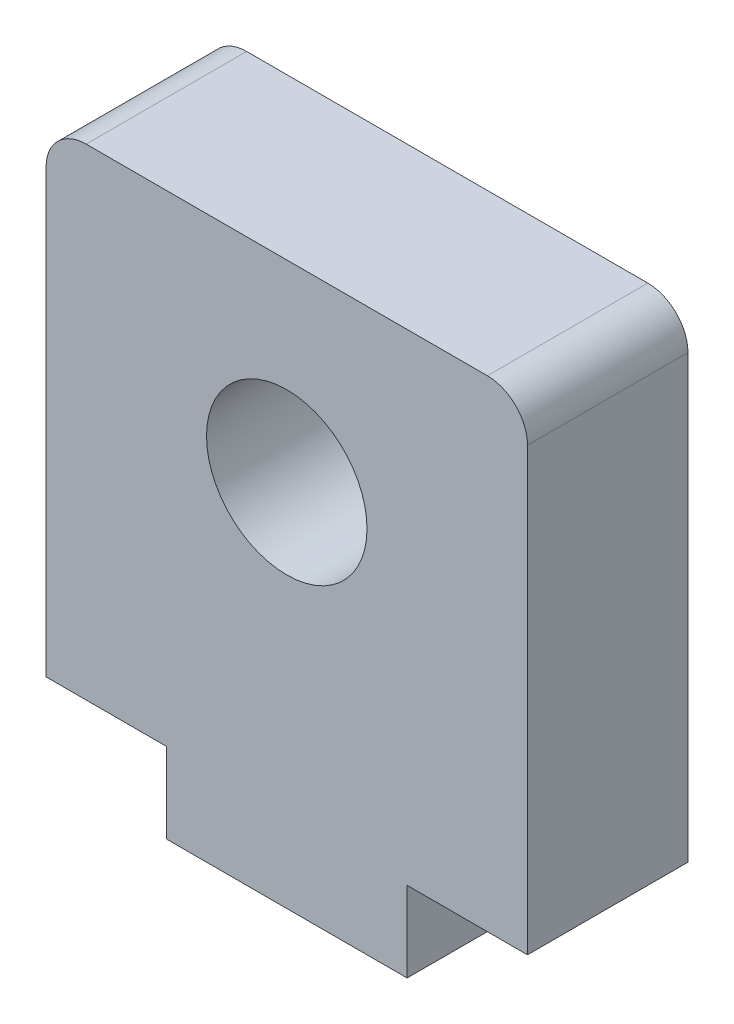
ISO-10303-21;
HEADER;
FILE_DESCRIPTION(('STEP AP214'),'2;1');
FILE_NAME('part.step','',(''),(''),'','','');
FILE_SCHEMA(('AUTOMOTIVE_DESIGN { 1 0 10303 214 1 1 1 1 }'));
ENDSEC;
DATA;
#1=APPLICATION_CONTEXT('core data for automotive mechanical design processes');
#2=APPLICATION_PROTOCOL_DEFINITION('international standard','automotive_design',2000,#1);
#3=PRODUCT_CONTEXT('',#1,'mechanical');
#4=PRODUCT('Part','Part','',(#3));
#5=PRODUCT_RELATED_PRODUCT_CATEGORY('part','',(#4));
#6=PRODUCT_DEFINITION_FORMATION('','',#4);
#7=PRODUCT_DEFINITION_CONTEXT('part definition',#1,'design');
#8=PRODUCT_DEFINITION('design','',#6,#7);
#9=PRODUCT_DEFINITION_SHAPE('','',#8);
#10=(LENGTH_UNIT() NAMED_UNIT(*) SI_UNIT(.MILLI.,.METRE.));
#11=(NAMED_UNIT(*) PLANE_ANGLE_UNIT() SI_UNIT($,.RADIAN.));
#12=(NAMED_UNIT(*) SI_UNIT($,.STERADIAN.) SOLID_ANGLE_UNIT());
#13=UNCERTAINTY_MEASURE_WITH_UNIT(LENGTH_MEASURE(1.E-05),#10,'distance_accuracy_value','');
#14=(GEOMETRIC_REPRESENTATION_CONTEXT(3) GLOBAL_UNCERTAINTY_ASSIGNED_CONTEXT((#13)) GLOBAL_UNIT_ASSIGNED_CONTEXT((#10,
#11,#12)) REPRESENTATION_CONTEXT('',''));
#15=CARTESIAN_POINT('',(0.,0.,0.));
#16=DIRECTION('',(0.,0.,1.));
#17=DIRECTION('',(1.,0.,0.));
#18=AXIS2_PLACEMENT_3D('',#15,#16,#17);
#19=CARTESIAN_POINT('',(-9.525,0.,6.35));
#20=DIRECTION('',(1.,0.,0.));
#21=DIRECTION('',(0.,1.,0.));
#22=AXIS2_PLACEMENT_3D('',#19,#20,#21);
#23=PLANE('',#22);
#24=DIRECTION('',(0.,-1.,0.));
#25=VECTOR('',#24,1.);
#26=CARTESIAN_POINT('',(-9.525,0.,6.35));
#27=LINE('',#26,#25);
#28=CARTESIAN_POINT('',(-9.525,9.52499999999999,6.35));
#29=VERTEX_POINT('',#28);
#30=CARTESIAN_POINT('',(-9.525,-7.93750000000001,6.35));
#31=VERTEX_POINT('',#30);
#32=EDGE_CURVE('E122',#29,#31,#27,.T.);
#33=ORIENTED_EDGE('',*,*,#32,.F.);
#34=DIRECTION('',(0.,0.,-1.));
#35=VECTOR('',#34,1.);
#36=CARTESIAN_POINT('',(-9.525,9.52499999999999,0.));
#37=LINE('',#36,#35);
#38=CARTESIAN_POINT('',(-9.525,9.52499999999999,0.));
#39=VERTEX_POINT('',#38);
#40=EDGE_CURVE('E12',#29,#39,#37,.T.);
#41=ORIENTED_EDGE('',*,*,#40,.T.);
#42=DIRECTION('',(0.,-1.,0.));
#43=VECTOR('',#42,1.);
#44=CARTESIAN_POINT('',(-9.525,0.,0.));
#45=LINE('',#44,#43);
#46=CARTESIAN_POINT('',(-9.525,-7.93750000000001,0.));
#47=VERTEX_POINT('',#46);
#48=EDGE_CURVE('E142',#39,#47,#45,.T.);
#49=ORIENTED_EDGE('',*,*,#48,.T.);
#50=DIRECTION('',(0.,0.,-1.));
#51=VECTOR('',#50,1.);
#52=CARTESIAN_POINT('',(-9.525,-7.93750000000001,6.35));
#53=LINE('',#52,#51);
#54=EDGE_CURVE('E135',#31,#47,#53,.T.);
#55=ORIENTED_EDGE('',*,*,#54,.F.);
#56=EDGE_LOOP('',(#33,#41,#49,#55));
#57=FACE_BOUND('',#56,.T.);
#58=ADVANCED_FACE('F46',(#57),#23,.F.);
#59=CARTESIAN_POINT('',(0.,-7.93750000000001,6.35));
#60=DIRECTION('',(0.,1.,0.));
#61=DIRECTION('',(0.,0.,1.));
#62=AXIS2_PLACEMENT_3D('',#59,#60,#61);
#63=PLANE('',#62);
#64=DIRECTION('',(1.,0.,0.));
#65=VECTOR('',#64,1.);
#66=CARTESIAN_POINT('',(0.,-7.93750000000001,0.));
#67=LINE('',#66,#65);
#68=CARTESIAN_POINT('',(-4.7625,-7.93750000000001,0.));
#69=VERTEX_POINT('',#68);
#70=EDGE_CURVE('E197',#47,#69,#67,.T.);
#71=ORIENTED_EDGE('',*,*,#70,.T.);
#72=DIRECTION('',(0.,0.,-1.));
#73=VECTOR('',#72,1.);
#74=CARTESIAN_POINT('',(-4.7625,-7.93750000000001,6.35));
#75=LINE('',#74,#73);
#76=CARTESIAN_POINT('',(-4.7625,-7.93750000000001,6.35));
#77=VERTEX_POINT('',#76);
#78=EDGE_CURVE('E137',#77,#69,#75,.T.);
#79=ORIENTED_EDGE('',*,*,#78,.F.);
#80=DIRECTION('',(1.,0.,0.));
#81=VECTOR('',#80,1.);
#82=CARTESIAN_POINT('',(0.,-7.93750000000001,6.35));
#83=LINE('',#82,#81);
#84=EDGE_CURVE('E125',#31,#77,#83,.T.);
#85=ORIENTED_EDGE('',*,*,#84,.F.);
#86=ORIENTED_EDGE('',*,*,#54,.T.);
#87=EDGE_LOOP('',(#71,#79,#85,#86));
#88=FACE_BOUND('',#87,.T.);
#89=ADVANCED_FACE('F134',(#88),#63,.F.);
#90=CARTESIAN_POINT('',(-4.7625,0.,6.35));
#91=DIRECTION('',(1.,0.,0.));
#92=DIRECTION('',(0.,0.,-1.));
#93=AXIS2_PLACEMENT_3D('',#90,#91,#92);
#94=PLANE('',#93);
#95=DIRECTION('',(0.,-1.,0.));
#96=VECTOR('',#95,1.);
#97=CARTESIAN_POINT('',(-4.7625,0.,0.));
#98=LINE('',#97,#96);
#99=CARTESIAN_POINT('',(-4.7625,-11.1125,0.));
#100=VERTEX_POINT('',#99);
#101=EDGE_CURVE('E199',#69,#100,#98,.T.);
#102=ORIENTED_EDGE('',*,*,#101,.T.);
#103=DIRECTION('',(0.,0.,-1.));
#104=VECTOR('',#103,1.);
#105=CARTESIAN_POINT('',(-4.7625,-11.1125,6.35));
#106=LINE('',#105,#104);
#107=CARTESIAN_POINT('',(-4.7625,-11.1125,6.35));
#108=VERTEX_POINT('',#107);
#109=EDGE_CURVE('E148',#108,#100,#106,.T.);
#110=ORIENTED_EDGE('',*,*,#109,.F.);
#111=DIRECTION('',(0.,-1.,0.));
#112=VECTOR('',#111,1.);
#113=CARTESIAN_POINT('',(-4.7625,0.,6.35));
#114=LINE('',#113,#112);
#115=EDGE_CURVE('E139',#77,#108,#114,.T.);
#116=ORIENTED_EDGE('',*,*,#115,.F.);
#117=ORIENTED_EDGE('',*,*,#78,.T.);
#118=EDGE_LOOP('',(#102,#110,#116,#117));
#119=FACE_BOUND('',#118,.T.);
#120=ADVANCED_FACE('F238',(#119),#94,.F.);
#121=CARTESIAN_POINT('',(0.,-11.1125,6.35));
#122=DIRECTION('',(0.,1.,0.));
#123=DIRECTION('',(0.,0.,1.));
#124=AXIS2_PLACEMENT_3D('',#121,#122,#123);
#125=PLANE('',#124);
#126=DIRECTION('',(1.,0.,0.));
#127=VECTOR('',#126,1.);
#128=CARTESIAN_POINT('',(0.,-11.1125,0.));
#129=LINE('',#128,#127);
#130=CARTESIAN_POINT('',(4.7625,-11.1125,0.));
#131=VERTEX_POINT('',#130);
#132=EDGE_CURVE('E202',#100,#131,#129,.T.);
#133=ORIENTED_EDGE('',*,*,#132,.T.);
#134=DIRECTION('',(0.,0.,-1.));
#135=VECTOR('',#134,1.);
#136=CARTESIAN_POINT('',(4.7625,-11.1125,6.35));
#137=LINE('',#136,#135);
#138=CARTESIAN_POINT('',(4.7625,-11.1125,6.35));
#139=VERTEX_POINT('',#138);
#140=EDGE_CURVE('E217',#139,#131,#137,.T.);
#141=ORIENTED_EDGE('',*,*,#140,.F.);
#142=DIRECTION('',(1.,0.,0.));
#143=VECTOR('',#142,1.);
#144=CARTESIAN_POINT('',(0.,-11.1125,6.35));
#145=LINE('',#144,#143);
#146=EDGE_CURVE('E176',#108,#139,#145,.T.);
#147=ORIENTED_EDGE('',*,*,#146,.F.);
#148=ORIENTED_EDGE('',*,*,#109,.T.);
#149=EDGE_LOOP('',(#133,#141,#147,#148));
#150=FACE_BOUND('',#149,.T.);
#151=ADVANCED_FACE('F223',(#150),#125,.F.);
#152=CARTESIAN_POINT('',(4.7625,0.,6.35));
#153=DIRECTION('',(1.,0.,0.));
#154=DIRECTION('',(0.,0.,-1.));
#155=AXIS2_PLACEMENT_3D('',#152,#153,#154);
#156=PLANE('',#155);
#157=DIRECTION('',(0.,-1.,0.));
#158=VECTOR('',#157,1.);
#159=CARTESIAN_POINT('',(4.7625,0.,0.));
#160=LINE('',#159,#158);
#161=CARTESIAN_POINT('',(4.7625,-7.93750000000001,0.));
#162=VERTEX_POINT('',#161);
#163=EDGE_CURVE('E205',#162,#131,#160,.T.);
#164=ORIENTED_EDGE('',*,*,#163,.F.);
#165=DIRECTION('',(0.,0.,-1.));
#166=VECTOR('',#165,1.);
#167=CARTESIAN_POINT('',(4.7625,-7.93750000000001,6.35));
#168=LINE('',#167,#166);
#169=CARTESIAN_POINT('',(4.7625,-7.93750000000001,6.35));
#170=VERTEX_POINT('',#169);
#171=EDGE_CURVE('E215',#170,#162,#168,.T.);
#172=ORIENTED_EDGE('',*,*,#171,.F.);
#173=DIRECTION('',(0.,-1.,0.));
#174=VECTOR('',#173,1.);
#175=CARTESIAN_POINT('',(4.7625,0.,6.35));
#176=LINE('',#175,#174);
#177=EDGE_CURVE('E180',#170,#139,#176,.T.);
#178=ORIENTED_EDGE('',*,*,#177,.T.);
#179=ORIENTED_EDGE('',*,*,#140,.T.);
#180=EDGE_LOOP('',(#164,#172,#178,#179));
#181=FACE_BOUND('',#180,.T.);
#182=ADVANCED_FACE('F233',(#181),#156,.T.);
#183=CARTESIAN_POINT('',(9.525,-7.93750000000001,0.));
#184=VERTEX_POINT('',#183);
#185=EDGE_CURVE('E200',#162,#184,#67,.T.);
#186=ORIENTED_EDGE('',*,*,#185,.T.);
#187=DIRECTION('',(0.,0.,-1.));
#188=VECTOR('',#187,1.);
#189=CARTESIAN_POINT('',(9.525,-7.93750000000001,6.35));
#190=LINE('',#189,#188);
#191=CARTESIAN_POINT('',(9.525,-7.93750000000001,6.35));
#192=VERTEX_POINT('',#191);
#193=EDGE_CURVE('E192',#192,#184,#190,.T.);
#194=ORIENTED_EDGE('',*,*,#193,.F.);
#195=EDGE_CURVE('E140',#170,#192,#83,.T.);
#196=ORIENTED_EDGE('',*,*,#195,.F.);
#197=ORIENTED_EDGE('',*,*,#171,.T.);
#198=EDGE_LOOP('',(#186,#194,#196,#197));
#199=FACE_BOUND('',#198,.T.);
#200=ADVANCED_FACE('F247',(#199),#63,.F.);
#201=CARTESIAN_POINT('',(9.525,0.,6.35));
#202=DIRECTION('',(1.,0.,0.));
#203=DIRECTION('',(0.,1.,0.));
#204=AXIS2_PLACEMENT_3D('',#201,#202,#203);
#205=PLANE('',#204);
#206=DIRECTION('',(0.,-1.,0.));
#207=VECTOR('',#206,1.);
#208=CARTESIAN_POINT('',(9.525,0.,0.));
#209=LINE('',#208,#207);
#210=CARTESIAN_POINT('',(9.525,9.52499999999999,0.));
#211=VERTEX_POINT('',#210);
#212=EDGE_CURVE('E208',#211,#184,#209,.T.);
#213=ORIENTED_EDGE('',*,*,#212,.F.);
#214=DIRECTION('',(0.,0.,-1.));
#215=VECTOR('',#214,1.);
#216=CARTESIAN_POINT('',(9.525,9.52499999999999,6.35));
#217=LINE('',#216,#215);
#218=CARTESIAN_POINT('',(9.525,9.52499999999999,6.35));
#219=VERTEX_POINT('',#218);
#220=EDGE_CURVE('E69',#211,#219,#217,.F.);
#221=ORIENTED_EDGE('',*,*,#220,.T.);
#222=DIRECTION('',(0.,-1.,0.));
#223=VECTOR('',#222,1.);
#224=CARTESIAN_POINT('',(9.525,0.,6.35));
#225=LINE('',#224,#223);
#226=EDGE_CURVE('E184',#219,#192,#225,.T.);
#227=ORIENTED_EDGE('',*,*,#226,.T.);
#228=ORIENTED_EDGE('',*,*,#193,.T.);
#229=EDGE_LOOP('',(#213,#221,#227,#228));
#230=FACE_BOUND('',#229,.T.);
#231=ADVANCED_FACE('F257',(#230),#205,.T.);
#232=CARTESIAN_POINT('',(0.,3.49249999999999,6.35));
#233=DIRECTION('',(0.,0.,-1.));
#234=DIRECTION('',(-1.,0.,0.));
#235=AXIS2_PLACEMENT_3D('',#232,#233,#234);
#236=CYLINDRICAL_SURFACE('',#235,3.175);
#237=CARTESIAN_POINT('',(0.,3.49249999999999,6.35));
#238=DIRECTION('',(0.,0.,1.));
#239=DIRECTION('',(1.,0.,0.));
#240=AXIS2_PLACEMENT_3D('',#237,#238,#239);
#241=CIRCLE('',#240,3.175);
#242=CARTESIAN_POINT('',(3.175,3.49249999999999,6.35));
#243=VERTEX_POINT('',#242);
#244=EDGE_CURVE('E130',#243,#243,#241,.T.);
#245=ORIENTED_EDGE('',*,*,#244,.T.);
#246=EDGE_LOOP('',(#245));
#247=FACE_BOUND('',#246,.T.);
#248=CARTESIAN_POINT('',(0.,3.49249999999999,0.));
#249=DIRECTION('',(0.,0.,1.));
#250=DIRECTION('',(1.,0.,0.));
#251=AXIS2_PLACEMENT_3D('',#248,#249,#250);
#252=CIRCLE('',#251,3.175);
#253=CARTESIAN_POINT('',(3.175,3.49249999999999,0.));
#254=VERTEX_POINT('',#253);
#255=EDGE_CURVE('E193',#254,#254,#252,.T.);
#256=ORIENTED_EDGE('',*,*,#255,.F.);
#257=EDGE_LOOP('',(#256));
#258=FACE_BOUND('',#257,.T.);
#259=ADVANCED_FACE('F255',(#247,#258),#236,.F.);
#260=CARTESIAN_POINT('',(0.,11.1125,6.35));
#261=DIRECTION('',(0.,1.,0.));
#262=DIRECTION('',(-1.,0.,0.));
#263=AXIS2_PLACEMENT_3D('',#260,#261,#262);
#264=PLANE('',#263);
#265=DIRECTION('',(1.,0.,0.));
#266=VECTOR('',#265,1.);
#267=CARTESIAN_POINT('',(0.,11.1125,6.35));
#268=LINE('',#267,#266);
#269=CARTESIAN_POINT('',(-7.9375,11.1125,6.35));
#270=VERTEX_POINT('',#269);
#271=CARTESIAN_POINT('',(7.9375,11.1125,6.35));
#272=VERTEX_POINT('',#271);
#273=EDGE_CURVE('E186',#270,#272,#268,.T.);
#274=ORIENTED_EDGE('',*,*,#273,.T.);
#275=DIRECTION('',(0.,0.,-1.));
#276=VECTOR('',#275,1.);
#277=CARTESIAN_POINT('',(7.9375,11.1125,6.35));
#278=LINE('',#277,#276);
#279=CARTESIAN_POINT('',(7.9375,11.1125,0.));
#280=VERTEX_POINT('',#279);
#281=EDGE_CURVE('E146',#272,#280,#278,.T.);
#282=ORIENTED_EDGE('',*,*,#281,.T.);
#283=DIRECTION('',(1.,0.,0.));
#284=VECTOR('',#283,1.);
#285=CARTESIAN_POINT('',(0.,11.1125,0.));
#286=LINE('',#285,#284);
#287=CARTESIAN_POINT('',(-7.9375,11.1125,0.));
#288=VERTEX_POINT('',#287);
#289=EDGE_CURVE('E210',#288,#280,#286,.T.);
#290=ORIENTED_EDGE('',*,*,#289,.F.);
#291=DIRECTION('',(0.,0.,-1.));
#292=VECTOR('',#291,1.);
#293=CARTESIAN_POINT('',(-7.9375,11.1125,6.35));
#294=LINE('',#293,#292);
#295=EDGE_CURVE('E144',#288,#270,#294,.F.);
#296=ORIENTED_EDGE('',*,*,#295,.T.);
#297=EDGE_LOOP('',(#274,#282,#290,#296));
#298=FACE_BOUND('',#297,.T.);
#299=ADVANCED_FACE('F256',(#298),#264,.T.);
#300=CARTESIAN_POINT('',(0.,0.,6.35));
#301=DIRECTION('',(0.,0.,1.));
#302=DIRECTION('',(1.,0.,0.));
#303=AXIS2_PLACEMENT_3D('',#300,#301,#302);
#304=PLANE('',#303);
#305=ORIENTED_EDGE('',*,*,#244,.F.);
#306=EDGE_LOOP('',(#305));
#307=FACE_BOUND('',#306,.T.);
#308=ORIENTED_EDGE('',*,*,#226,.F.);
#309=CARTESIAN_POINT('',(7.9375,9.52499999999999,6.35));
#310=DIRECTION('',(0.,0.,1.));
#311=DIRECTION('',(1.,0.,0.));
#312=AXIS2_PLACEMENT_3D('',#309,#310,#311);
#313=CIRCLE('',#312,1.5875);
#314=EDGE_CURVE('E54',#219,#272,#313,.T.);
#315=ORIENTED_EDGE('',*,*,#314,.T.);
#316=ORIENTED_EDGE('',*,*,#273,.F.);
#317=CARTESIAN_POINT('',(-7.9375,9.52499999999999,6.35));
#318=DIRECTION('',(0.,0.,1.));
#319=DIRECTION('',(1.,0.,0.));
#320=AXIS2_PLACEMENT_3D('',#317,#318,#319);
#321=CIRCLE('',#320,1.5875);
#322=EDGE_CURVE('E61',#270,#29,#321,.T.);
#323=ORIENTED_EDGE('',*,*,#322,.T.);
#324=ORIENTED_EDGE('',*,*,#32,.T.);
#325=ORIENTED_EDGE('',*,*,#84,.T.);
#326=ORIENTED_EDGE('',*,*,#115,.T.);
#327=ORIENTED_EDGE('',*,*,#146,.T.);
#328=ORIENTED_EDGE('',*,*,#177,.F.);
#329=ORIENTED_EDGE('',*,*,#195,.T.);
#330=EDGE_LOOP('',(#308,#315,#316,#323,#324,#325,#326,#327,#328,#329));
#331=FACE_BOUND('',#330,.T.);
#332=ADVANCED_FACE('F124',(#307,#331),#304,.T.);
#333=CARTESIAN_POINT('',(0.,0.,0.));
#334=DIRECTION('',(0.,0.,1.));
#335=DIRECTION('',(1.,0.,0.));
#336=AXIS2_PLACEMENT_3D('',#333,#334,#335);
#337=PLANE('',#336);
#338=ORIENTED_EDGE('',*,*,#255,.T.);
#339=EDGE_LOOP('',(#338));
#340=FACE_BOUND('',#339,.T.);
#341=ORIENTED_EDGE('',*,*,#289,.T.);
#342=CARTESIAN_POINT('',(7.9375,9.52499999999999,0.));
#343=DIRECTION('',(0.,0.,1.));
#344=DIRECTION('',(1.,0.,0.));
#345=AXIS2_PLACEMENT_3D('',#342,#343,#344);
#346=CIRCLE('',#345,1.5875);
#347=EDGE_CURVE('E156',#280,#211,#346,.F.);
#348=ORIENTED_EDGE('',*,*,#347,.T.);
#349=ORIENTED_EDGE('',*,*,#212,.T.);
#350=ORIENTED_EDGE('',*,*,#185,.F.);
#351=ORIENTED_EDGE('',*,*,#163,.T.);
#352=ORIENTED_EDGE('',*,*,#132,.F.);
#353=ORIENTED_EDGE('',*,*,#101,.F.);
#354=ORIENTED_EDGE('',*,*,#70,.F.);
#355=ORIENTED_EDGE('',*,*,#48,.F.);
#356=CARTESIAN_POINT('',(-7.9375,9.52499999999999,0.));
#357=DIRECTION('',(0.,0.,1.));
#358=DIRECTION('',(1.,0.,0.));
#359=AXIS2_PLACEMENT_3D('',#356,#357,#358);
#360=CIRCLE('',#359,1.5875);
#361=EDGE_CURVE('E154',#39,#288,#360,.F.);
#362=ORIENTED_EDGE('',*,*,#361,.T.);
#363=EDGE_LOOP('',(#341,#348,#349,#350,#351,#352,#353,#354,#355,#362));
#364=FACE_BOUND('',#363,.T.);
#365=ADVANCED_FACE('F228',(#340,#364),#337,.F.);
#366=CARTESIAN_POINT('',(7.9375,9.52499999999999,6.35));
#367=DIRECTION('',(0.,0.,-1.));
#368=DIRECTION('',(-1.,0.,0.));
#369=AXIS2_PLACEMENT_3D('',#366,#367,#368);
#370=CYLINDRICAL_SURFACE('',#369,1.5875);
#371=ORIENTED_EDGE('',*,*,#314,.F.);
#372=ORIENTED_EDGE('',*,*,#220,.F.);
#373=ORIENTED_EDGE('',*,*,#347,.F.);
#374=ORIENTED_EDGE('',*,*,#281,.F.);
#375=EDGE_LOOP('',(#371,#372,#373,#374));
#376=FACE_BOUND('',#375,.T.);
#377=ADVANCED_FACE('F259',(#376),#370,.T.);
#378=CARTESIAN_POINT('',(-7.9375,9.52499999999999,6.35));
#379=DIRECTION('',(0.,0.,1.));
#380=DIRECTION('',(1.,0.,0.));
#381=AXIS2_PLACEMENT_3D('',#378,#379,#380);
#382=CYLINDRICAL_SURFACE('',#381,1.5875);
#383=ORIENTED_EDGE('',*,*,#322,.F.);
#384=ORIENTED_EDGE('',*,*,#295,.F.);
#385=ORIENTED_EDGE('',*,*,#361,.F.);
#386=ORIENTED_EDGE('',*,*,#40,.F.);
#387=EDGE_LOOP('',(#383,#384,#385,#386));
#388=FACE_BOUND('',#387,.T.);
#389=ADVANCED_FACE('F48',(#388),#382,.T.);
#390=CLOSED_SHELL('',(#58,#89,#120,#151,#182,#200,#231,#259,#299,#332,#365,#377,#389));
#391=MANIFOLD_SOLID_BREP('B2',#390);
#392=ADVANCED_BREP_SHAPE_REPRESENTATION('',(#18,#391),#14);
#393=SHAPE_DEFINITION_REPRESENTATION(#9,#392);
ENDSEC;
END-ISO-10303-21;
